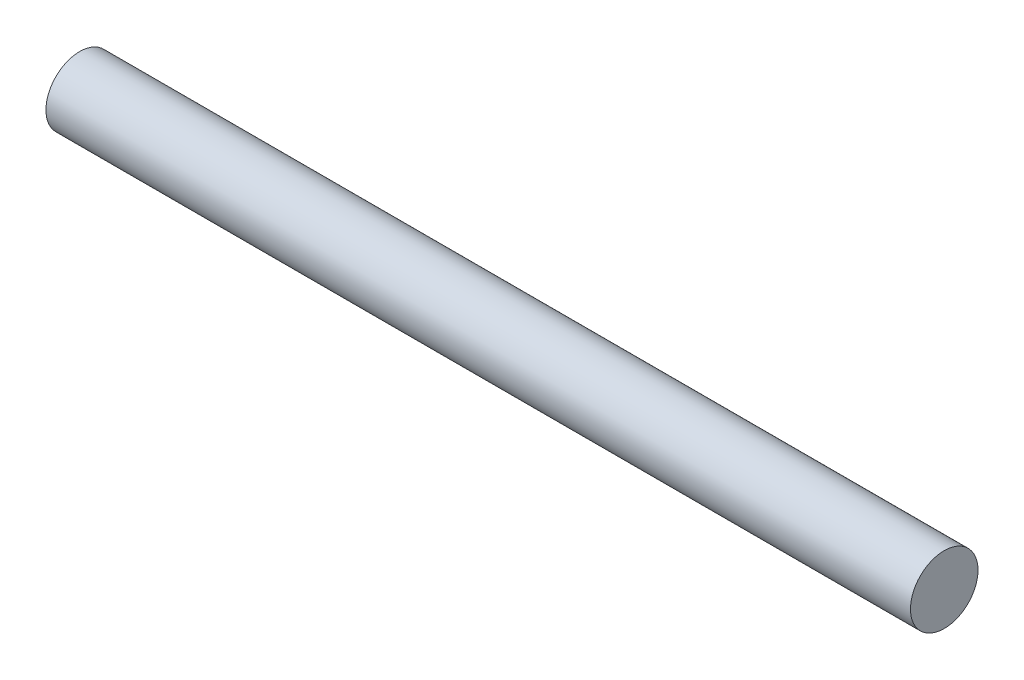
ISO-10303-21;
HEADER;
FILE_DESCRIPTION(('STEP AP214'),'2;1');
FILE_NAME('part.step','',(''),(''),'','','');
FILE_SCHEMA(('AUTOMOTIVE_DESIGN { 1 0 10303 214 1 1 1 1 }'));
ENDSEC;
DATA;
#1=APPLICATION_CONTEXT('core data for automotive mechanical design processes');
#2=APPLICATION_PROTOCOL_DEFINITION('international standard','automotive_design',2000,#1);
#3=PRODUCT_CONTEXT('',#1,'mechanical');
#4=PRODUCT('Part','Part','',(#3));
#5=PRODUCT_RELATED_PRODUCT_CATEGORY('part','',(#4));
#6=PRODUCT_DEFINITION_FORMATION('','',#4);
#7=PRODUCT_DEFINITION_CONTEXT('part definition',#1,'design');
#8=PRODUCT_DEFINITION('design','',#6,#7);
#9=PRODUCT_DEFINITION_SHAPE('','',#8);
#10=(LENGTH_UNIT() NAMED_UNIT(*) SI_UNIT(.MILLI.,.METRE.));
#11=(NAMED_UNIT(*) PLANE_ANGLE_UNIT() SI_UNIT($,.RADIAN.));
#12=(NAMED_UNIT(*) SI_UNIT($,.STERADIAN.) SOLID_ANGLE_UNIT());
#13=UNCERTAINTY_MEASURE_WITH_UNIT(LENGTH_MEASURE(1.E-05),#10,'distance_accuracy_value','');
#14=(GEOMETRIC_REPRESENTATION_CONTEXT(3) GLOBAL_UNCERTAINTY_ASSIGNED_CONTEXT((#13)) GLOBAL_UNIT_ASSIGNED_CONTEXT((#10,
#11,#12)) REPRESENTATION_CONTEXT('',''));
#15=CARTESIAN_POINT('',(0.,0.,0.));
#16=DIRECTION('',(0.,0.,1.));
#17=DIRECTION('',(1.,0.,0.));
#18=AXIS2_PLACEMENT_3D('',#15,#16,#17);
#19=CARTESIAN_POINT('',(64.,0.,0.));
#20=DIRECTION('',(-1.,0.,0.));
#21=DIRECTION('',(0.,0.,1.));
#22=AXIS2_PLACEMENT_3D('',#19,#20,#21);
#23=CYLINDRICAL_SURFACE('',#22,2.5);
#24=CARTESIAN_POINT('',(64.,0.,0.));
#25=DIRECTION('',(1.,0.,0.));
#26=DIRECTION('',(0.,0.,-1.));
#27=AXIS2_PLACEMENT_3D('',#24,#25,#26);
#28=CIRCLE('',#27,2.5);
#29=CARTESIAN_POINT('',(64.,0.,-2.5));
#30=VERTEX_POINT('',#29);
#31=EDGE_CURVE('E10',#30,#30,#28,.T.);
#32=ORIENTED_EDGE('',*,*,#31,.F.);
#33=EDGE_LOOP('',(#32));
#34=FACE_BOUND('',#33,.T.);
#35=CARTESIAN_POINT('',(0.,0.,0.));
#36=DIRECTION('',(1.,0.,0.));
#37=DIRECTION('',(0.,0.,-1.));
#38=AXIS2_PLACEMENT_3D('',#35,#36,#37);
#39=CIRCLE('',#38,2.5);
#40=CARTESIAN_POINT('',(0.,0.,-2.5));
#41=VERTEX_POINT('',#40);
#42=EDGE_CURVE('E46',#41,#41,#39,.T.);
#43=ORIENTED_EDGE('',*,*,#42,.T.);
#44=EDGE_LOOP('',(#43));
#45=FACE_BOUND('',#44,.T.);
#46=ADVANCED_FACE('F43',(#34,#45),#23,.T.);
#47=CARTESIAN_POINT('',(64.,0.,0.));
#48=DIRECTION('',(1.,0.,0.));
#49=DIRECTION('',(0.,0.,-1.));
#50=AXIS2_PLACEMENT_3D('',#47,#48,#49);
#51=PLANE('',#50);
#52=ORIENTED_EDGE('',*,*,#31,.T.);
#53=EDGE_LOOP('',(#52));
#54=FACE_BOUND('',#53,.T.);
#55=ADVANCED_FACE('F60',(#54),#51,.T.);
#56=CARTESIAN_POINT('',(0.,0.,0.));
#57=DIRECTION('',(1.,0.,0.));
#58=DIRECTION('',(0.,0.,-1.));
#59=AXIS2_PLACEMENT_3D('',#56,#57,#58);
#60=PLANE('',#59);
#61=ORIENTED_EDGE('',*,*,#42,.F.);
#62=EDGE_LOOP('',(#61));
#63=FACE_BOUND('',#62,.T.);
#64=ADVANCED_FACE('F58',(#63),#60,.F.);
#65=CLOSED_SHELL('',(#46,#55,#64));
#66=MANIFOLD_SOLID_BREP('B2',#65);
#67=ADVANCED_BREP_SHAPE_REPRESENTATION('',(#18,#66),#14);
#68=SHAPE_DEFINITION_REPRESENTATION(#9,#67);
ENDSEC;
END-ISO-10303-21;
